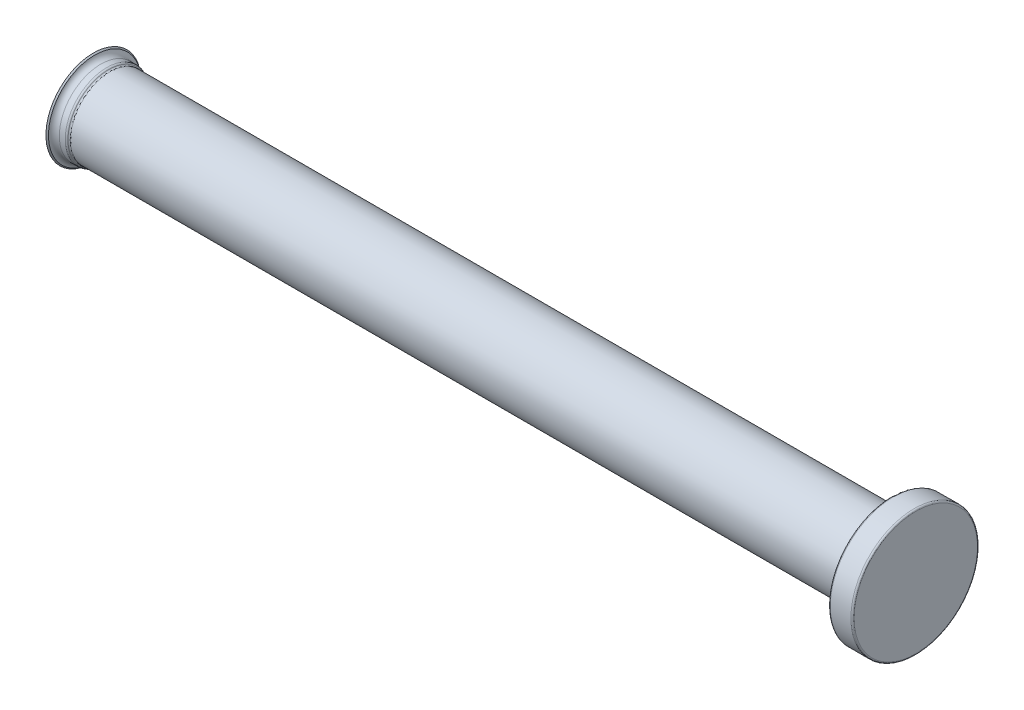
ISO-10303-21;
HEADER;
FILE_DESCRIPTION(('STEP AP214'),'2;1');
FILE_NAME('part.step','',(''),(''),'','','');
FILE_SCHEMA(('AUTOMOTIVE_DESIGN { 1 0 10303 214 1 1 1 1 }'));
ENDSEC;
DATA;
#1=APPLICATION_CONTEXT('core data for automotive mechanical design processes');
#2=APPLICATION_PROTOCOL_DEFINITION('international standard','automotive_design',2000,#1);
#3=PRODUCT_CONTEXT('',#1,'mechanical');
#4=PRODUCT('Part','Part','',(#3));
#5=PRODUCT_RELATED_PRODUCT_CATEGORY('part','',(#4));
#6=PRODUCT_DEFINITION_FORMATION('','',#4);
#7=PRODUCT_DEFINITION_CONTEXT('part definition',#1,'design');
#8=PRODUCT_DEFINITION('design','',#6,#7);
#9=PRODUCT_DEFINITION_SHAPE('','',#8);
#10=(LENGTH_UNIT() NAMED_UNIT(*) SI_UNIT(.MILLI.,.METRE.));
#11=(NAMED_UNIT(*) PLANE_ANGLE_UNIT() SI_UNIT($,.RADIAN.));
#12=(NAMED_UNIT(*) SI_UNIT($,.STERADIAN.) SOLID_ANGLE_UNIT());
#13=UNCERTAINTY_MEASURE_WITH_UNIT(LENGTH_MEASURE(1.E-05),#10,'distance_accuracy_value','');
#14=(GEOMETRIC_REPRESENTATION_CONTEXT(3) GLOBAL_UNCERTAINTY_ASSIGNED_CONTEXT((#13)) GLOBAL_UNIT_ASSIGNED_CONTEXT((#10,
#11,#12)) REPRESENTATION_CONTEXT('',''));
#15=CARTESIAN_POINT('',(0.,0.,0.));
#16=DIRECTION('',(0.,0.,1.));
#17=DIRECTION('',(1.,0.,0.));
#18=AXIS2_PLACEMENT_3D('',#15,#16,#17);
#19=CARTESIAN_POINT('',(-51.5,0.,0.));
#20=DIRECTION('',(1.,0.,0.));
#21=DIRECTION('',(0.,0.,-1.));
#22=AXIS2_PLACEMENT_3D('',#19,#20,#21);
#23=TOROIDAL_SURFACE('',#22,3.02521946668532,0.525219466685324);
#24=CARTESIAN_POINT('',(-51.5,0.,0.));
#25=DIRECTION('',(1.,0.,0.));
#26=DIRECTION('',(0.,0.,-1.));
#27=AXIS2_PLACEMENT_3D('',#24,#25,#26);
#28=CIRCLE('',#27,2.49999999999999);
#29=CARTESIAN_POINT('',(-51.5,0.,-2.49999999999999));
#30=VERTEX_POINT('',#29);
#31=EDGE_CURVE('E77',#30,#30,#28,.T.);
#32=ORIENTED_EDGE('',*,*,#31,.T.);
#33=EDGE_LOOP('',(#32));
#34=FACE_BOUND('',#33,.T.);
#35=CARTESIAN_POINT('',(-52.0081443403791,0.,0.));
#36=DIRECTION('',(1.,0.,0.));
#37=DIRECTION('',(0.,0.,-1.));
#38=AXIS2_PLACEMENT_3D('',#35,#36,#37);
#39=CIRCLE('',#38,2.8923856700598);
#40=CARTESIAN_POINT('',(-52.0081443403791,0.,-2.8923856700598));
#41=VERTEX_POINT('',#40);
#42=EDGE_CURVE('E11',#41,#41,#39,.T.);
#43=ORIENTED_EDGE('',*,*,#42,.F.);
#44=EDGE_LOOP('',(#43));
#45=FACE_BOUND('',#44,.T.);
#46=ADVANCED_FACE('F40',(#34,#45),#23,.T.);
#47=CARTESIAN_POINT('',(-51.9715621544505,0.,0.));
#48=DIRECTION('',(1.,0.,0.));
#49=DIRECTION('',(0.,0.,-1.));
#50=AXIS2_PLACEMENT_3D('',#47,#48,#49);
#51=CONICAL_SURFACE('',#50,3.,1.24311351451278);
#52=ORIENTED_EDGE('',*,*,#42,.T.);
#53=EDGE_LOOP('',(#52));
#54=FACE_BOUND('',#53,.T.);
#55=CARTESIAN_POINT('',(-51.9715621544505,0.,0.));
#56=DIRECTION('',(1.,0.,0.));
#57=DIRECTION('',(0.,0.,-1.));
#58=AXIS2_PLACEMENT_3D('',#55,#56,#57);
#59=CIRCLE('',#58,3.);
#60=CARTESIAN_POINT('',(-51.9715621544505,0.,-3.));
#61=VERTEX_POINT('',#60);
#62=EDGE_CURVE('E46',#61,#61,#59,.T.);
#63=ORIENTED_EDGE('',*,*,#62,.F.);
#64=EDGE_LOOP('',(#63));
#65=FACE_BOUND('',#64,.T.);
#66=ADVANCED_FACE('F95',(#54,#65),#51,.T.);
#67=CARTESIAN_POINT('',(-51.8869958161193,0.,0.));
#68=DIRECTION('',(-1.,0.,0.));
#69=DIRECTION('',(0.,0.,1.));
#70=AXIS2_PLACEMENT_3D('',#67,#68,#69);
#71=CONICAL_SURFACE('',#70,2.92405505443393,0.731737660460374);
#72=ORIENTED_EDGE('',*,*,#62,.T.);
#73=EDGE_LOOP('',(#72));
#74=FACE_BOUND('',#73,.T.);
#75=CARTESIAN_POINT('',(-51.8869958161193,0.,0.));
#76=DIRECTION('',(1.,0.,0.));
#77=DIRECTION('',(0.,0.,-1.));
#78=AXIS2_PLACEMENT_3D('',#75,#76,#77);
#79=CIRCLE('',#78,2.92405505443393);
#80=CARTESIAN_POINT('',(-51.8869958161193,0.,-2.92405505443393));
#81=VERTEX_POINT('',#80);
#82=EDGE_CURVE('E50',#81,#81,#79,.T.);
#83=ORIENTED_EDGE('',*,*,#82,.F.);
#84=EDGE_LOOP('',(#83));
#85=FACE_BOUND('',#84,.T.);
#86=ADVANCED_FACE('F99',(#74,#85),#71,.T.);
#87=CARTESIAN_POINT('',(-51.5,0.,0.));
#88=DIRECTION('',(1.,0.,0.));
#89=DIRECTION('',(0.,0.,-1.));
#90=AXIS2_PLACEMENT_3D('',#87,#88,#89);
#91=TOROIDAL_SURFACE('',#90,3.02521946668532,0.4);
#92=ORIENTED_EDGE('',*,*,#82,.T.);
#93=EDGE_LOOP('',(#92));
#94=FACE_BOUND('',#93,.T.);
#95=CARTESIAN_POINT('',(-51.5,0.,0.));
#96=DIRECTION('',(1.,0.,0.));
#97=DIRECTION('',(0.,0.,-1.));
#98=AXIS2_PLACEMENT_3D('',#95,#96,#97);
#99=CIRCLE('',#98,2.62521946668532);
#100=CARTESIAN_POINT('',(-51.5,0.,-2.62521946668532));
#101=VERTEX_POINT('',#100);
#102=EDGE_CURVE('E54',#101,#101,#99,.T.);
#103=ORIENTED_EDGE('',*,*,#102,.F.);
#104=EDGE_LOOP('',(#103));
#105=FACE_BOUND('',#104,.T.);
#106=ADVANCED_FACE('F103',(#94,#105),#91,.F.);
#107=CARTESIAN_POINT('',(-51.,0.,0.));
#108=DIRECTION('',(1.,0.,0.));
#109=DIRECTION('',(0.,0.,-1.));
#110=AXIS2_PLACEMENT_3D('',#107,#108,#109);
#111=CYLINDRICAL_SURFACE('',#110,2.62521946668532);
#112=ORIENTED_EDGE('',*,*,#102,.T.);
#113=EDGE_LOOP('',(#112));
#114=FACE_BOUND('',#113,.T.);
#115=CARTESIAN_POINT('',(-51.1252194666853,0.,0.));
#116=DIRECTION('',(1.,0.,0.));
#117=DIRECTION('',(0.,0.,-1.));
#118=AXIS2_PLACEMENT_3D('',#115,#116,#117);
#119=CIRCLE('',#118,2.62521946668532);
#120=CARTESIAN_POINT('',(-51.1252194666853,0.,-2.62521946668532));
#121=VERTEX_POINT('',#120);
#122=EDGE_CURVE('E59',#121,#121,#119,.T.);
#123=ORIENTED_EDGE('',*,*,#122,.F.);
#124=EDGE_LOOP('',(#123));
#125=FACE_BOUND('',#124,.T.);
#126=ADVANCED_FACE('F109',(#114,#125),#111,.T.);
#127=CARTESIAN_POINT('',(-51.1252194666853,0.,0.));
#128=DIRECTION('',(1.,0.,0.));
#129=DIRECTION('',(0.,0.,-1.));
#130=AXIS2_PLACEMENT_3D('',#127,#128,#129);
#131=TOROIDAL_SURFACE('',#130,2.5,0.125219466685319);
#132=ORIENTED_EDGE('',*,*,#122,.T.);
#133=EDGE_LOOP('',(#132));
#134=FACE_BOUND('',#133,.T.);
#135=CARTESIAN_POINT('',(-51.0167762274875,0.,0.));
#136=DIRECTION('',(1.,0.,0.));
#137=DIRECTION('',(0.,0.,-1.));
#138=AXIS2_PLACEMENT_3D('',#135,#136,#137);
#139=CIRCLE('',#138,2.56260973334266);
#140=CARTESIAN_POINT('',(-51.0167762274875,0.,-2.56260973334266));
#141=VERTEX_POINT('',#140);
#142=EDGE_CURVE('E62',#141,#141,#139,.T.);
#143=ORIENTED_EDGE('',*,*,#142,.F.);
#144=EDGE_LOOP('',(#143));
#145=FACE_BOUND('',#144,.T.);
#146=ADVANCED_FACE('F113',(#134,#145),#131,.T.);
#147=CARTESIAN_POINT('',(-50.9083329882897,0.,0.));
#148=DIRECTION('',(1.,0.,0.));
#149=DIRECTION('',(0.,0.,-1.));
#150=AXIS2_PLACEMENT_3D('',#147,#148,#149);
#151=TOROIDAL_SURFACE('',#150,2.62521946668532,0.125219466685323);
#152=ORIENTED_EDGE('',*,*,#142,.T.);
#153=EDGE_LOOP('',(#152));
#154=FACE_BOUND('',#153,.T.);
#155=CARTESIAN_POINT('',(-50.9083329882897,0.,0.));
#156=DIRECTION('',(1.,0.,0.));
#157=DIRECTION('',(0.,0.,-1.));
#158=AXIS2_PLACEMENT_3D('',#155,#156,#157);
#159=CIRCLE('',#158,2.5);
#160=CARTESIAN_POINT('',(-50.9083329882897,0.,-2.5));
#161=VERTEX_POINT('',#160);
#162=EDGE_CURVE('E65',#161,#161,#159,.T.);
#163=ORIENTED_EDGE('',*,*,#162,.F.);
#164=EDGE_LOOP('',(#163));
#165=FACE_BOUND('',#164,.T.);
#166=ADVANCED_FACE('F117',(#154,#165),#151,.F.);
#167=CARTESIAN_POINT('',(-50.9083329882897,2.5,0.));
#168=DIRECTION('',(1.,0.,0.));
#169=DIRECTION('',(0.,0.,-1.));
#170=AXIS2_PLACEMENT_3D('',#167,#168,#169);
#171=PLANE('',#170);
#172=ORIENTED_EDGE('',*,*,#162,.T.);
#173=EDGE_LOOP('',(#172));
#174=FACE_BOUND('',#173,.T.);
#175=CARTESIAN_POINT('',(-50.9083329882897,0.,0.));
#176=DIRECTION('',(1.,0.,0.));
#177=DIRECTION('',(0.,0.,-1.));
#178=AXIS2_PLACEMENT_3D('',#175,#176,#177);
#179=CIRCLE('',#178,2.00059573308664);
#180=CARTESIAN_POINT('',(-50.9083329882897,0.,-2.00059573308664));
#181=VERTEX_POINT('',#180);
#182=EDGE_CURVE('E68',#181,#181,#179,.T.);
#183=ORIENTED_EDGE('',*,*,#182,.F.);
#184=EDGE_LOOP('',(#183));
#185=FACE_BOUND('',#184,.T.);
#186=ADVANCED_FACE('F121',(#174,#185),#171,.T.);
#187=CARTESIAN_POINT('',(-51.,0.,0.));
#188=DIRECTION('',(-1.,0.,0.));
#189=DIRECTION('',(0.,0.,1.));
#190=AXIS2_PLACEMENT_3D('',#187,#188,#189);
#191=CONICAL_SURFACE('',#190,2.40261794878175,1.34661422179852);
#192=ORIENTED_EDGE('',*,*,#182,.T.);
#193=EDGE_LOOP('',(#192));
#194=FACE_BOUND('',#193,.T.);
#195=CARTESIAN_POINT('',(-51.,0.,0.));
#196=DIRECTION('',(1.,0.,0.));
#197=DIRECTION('',(0.,0.,-1.));
#198=AXIS2_PLACEMENT_3D('',#195,#196,#197);
#199=CIRCLE('',#198,2.40261794878175);
#200=CARTESIAN_POINT('',(-51.,0.,-2.40261794878175));
#201=VERTEX_POINT('',#200);
#202=EDGE_CURVE('E71',#201,#201,#199,.T.);
#203=ORIENTED_EDGE('',*,*,#202,.F.);
#204=EDGE_LOOP('',(#203));
#205=FACE_BOUND('',#204,.T.);
#206=ADVANCED_FACE('F91',(#194,#205),#191,.F.);
#207=CARTESIAN_POINT('',(-51.1220860071305,0.,0.));
#208=DIRECTION('',(1.,0.,0.));
#209=DIRECTION('',(0.,0.,-1.));
#210=AXIS2_PLACEMENT_3D('',#207,#208,#209);
#211=TOROIDAL_SURFACE('',#210,2.37478053331467,0.125219466685323);
#212=ORIENTED_EDGE('',*,*,#202,.T.);
#213=EDGE_LOOP('',(#212));
#214=FACE_BOUND('',#213,.T.);
#215=CARTESIAN_POINT('',(-51.1220860071305,0.,0.));
#216=DIRECTION('',(1.,0.,0.));
#217=DIRECTION('',(0.,0.,-1.));
#218=AXIS2_PLACEMENT_3D('',#215,#216,#217);
#219=CIRCLE('',#218,2.5);
#220=CARTESIAN_POINT('',(-51.1220860071305,0.,-2.5));
#221=VERTEX_POINT('',#220);
#222=EDGE_CURVE('E74',#221,#221,#219,.T.);
#223=ORIENTED_EDGE('',*,*,#222,.F.);
#224=EDGE_LOOP('',(#223));
#225=FACE_BOUND('',#224,.T.);
#226=ADVANCED_FACE('F85',(#214,#225),#211,.F.);
#227=CARTESIAN_POINT('',(-51.,0.,0.));
#228=DIRECTION('',(1.,0.,0.));
#229=DIRECTION('',(0.,0.,-1.));
#230=AXIS2_PLACEMENT_3D('',#227,#228,#229);
#231=CYLINDRICAL_SURFACE('',#230,2.5);
#232=ORIENTED_EDGE('',*,*,#222,.T.);
#233=EDGE_LOOP('',(#232));
#234=FACE_BOUND('',#233,.T.);
#235=ORIENTED_EDGE('',*,*,#31,.F.);
#236=EDGE_LOOP('',(#235));
#237=FACE_BOUND('',#236,.T.);
#238=ADVANCED_FACE('F83',(#234,#237),#231,.F.);
#239=CLOSED_SHELL('',(#46,#66,#86,#106,#126,#146,#166,#186,#206,#226,#238));
#240=MANIFOLD_SOLID_BREP('B2',#239);
#241=CARTESIAN_POINT('',(0.,0.,0.));
#242=DIRECTION('',(-1.,0.,0.));
#243=DIRECTION('',(0.,0.,1.));
#244=AXIS2_PLACEMENT_3D('',#241,#242,#243);
#245=PLANE('',#244);
#246=CARTESIAN_POINT('',(0.,0.,0.));
#247=DIRECTION('',(-1.,0.,0.));
#248=DIRECTION('',(0.,0.,1.));
#249=AXIS2_PLACEMENT_3D('',#246,#247,#248);
#250=CIRCLE('',#249,3.9);
#251=CARTESIAN_POINT('',(0.,0.,3.9));
#252=VERTEX_POINT('',#251);
#253=EDGE_CURVE('E213',#252,#252,#250,.F.);
#254=ORIENTED_EDGE('',*,*,#253,.T.);
#255=EDGE_LOOP('',(#254));
#256=FACE_BOUND('',#255,.T.);
#257=ADVANCED_FACE('F206',(#256),#245,.F.);
#258=CARTESIAN_POINT('',(0.,0.,0.));
#259=DIRECTION('',(-1.,0.,0.));
#260=DIRECTION('',(0.,0.,1.));
#261=AXIS2_PLACEMENT_3D('',#258,#259,#260);
#262=CYLINDRICAL_SURFACE('',#261,4.);
#263=CARTESIAN_POINT('',(-0.1,0.,0.));
#264=DIRECTION('',(-1.,0.,0.));
#265=DIRECTION('',(0.,0.,1.));
#266=AXIS2_PLACEMENT_3D('',#263,#264,#265);
#267=CIRCLE('',#266,4.);
#268=CARTESIAN_POINT('',(-0.1,0.,4.));
#269=VERTEX_POINT('',#268);
#270=EDGE_CURVE('E232',#269,#269,#267,.T.);
#271=ORIENTED_EDGE('',*,*,#270,.T.);
#272=EDGE_LOOP('',(#271));
#273=FACE_BOUND('',#272,.T.);
#274=CARTESIAN_POINT('',(-1.4,0.,0.));
#275=DIRECTION('',(1.,0.,0.));
#276=DIRECTION('',(0.,0.,-1.));
#277=AXIS2_PLACEMENT_3D('',#274,#275,#276);
#278=CIRCLE('',#277,4.);
#279=CARTESIAN_POINT('',(-1.4,0.,-4.));
#280=VERTEX_POINT('',#279);
#281=EDGE_CURVE('E227',#280,#280,#278,.T.);
#282=ORIENTED_EDGE('',*,*,#281,.T.);
#283=EDGE_LOOP('',(#282));
#284=FACE_BOUND('',#283,.T.);
#285=ADVANCED_FACE('F244',(#273,#284),#262,.T.);
#286=CARTESIAN_POINT('',(-1.5,4.,0.));
#287=DIRECTION('',(1.,0.,0.));
#288=DIRECTION('',(0.,0.,-1.));
#289=AXIS2_PLACEMENT_3D('',#286,#287,#288);
#290=PLANE('',#289);
#291=CARTESIAN_POINT('',(-1.5,0.,0.));
#292=DIRECTION('',(1.,0.,0.));
#293=DIRECTION('',(0.,0.,-1.));
#294=AXIS2_PLACEMENT_3D('',#291,#292,#293);
#295=CIRCLE('',#294,3.9);
#296=CARTESIAN_POINT('',(-1.5,0.,-3.9));
#297=VERTEX_POINT('',#296);
#298=EDGE_CURVE('E38',#297,#297,#295,.F.);
#299=ORIENTED_EDGE('',*,*,#298,.T.);
#300=EDGE_LOOP('',(#299));
#301=FACE_BOUND('',#300,.T.);
#302=CARTESIAN_POINT('',(-1.5,0.,0.));
#303=DIRECTION('',(-1.,0.,0.));
#304=DIRECTION('',(0.,0.,1.));
#305=AXIS2_PLACEMENT_3D('',#302,#303,#304);
#306=CIRCLE('',#305,2.5);
#307=CARTESIAN_POINT('',(-1.5,0.,2.5));
#308=VERTEX_POINT('',#307);
#309=EDGE_CURVE('E224',#308,#308,#306,.T.);
#310=ORIENTED_EDGE('',*,*,#309,.F.);
#311=EDGE_LOOP('',(#310));
#312=FACE_BOUND('',#311,.T.);
#313=ADVANCED_FACE('F247',(#301,#312),#290,.F.);
#314=CARTESIAN_POINT('',(0.,0.,0.));
#315=DIRECTION('',(-1.,0.,0.));
#316=DIRECTION('',(0.,0.,1.));
#317=AXIS2_PLACEMENT_3D('',#314,#315,#316);
#318=CYLINDRICAL_SURFACE('',#317,2.5);
#319=CARTESIAN_POINT('',(-51.,0.,0.));
#320=DIRECTION('',(-1.,0.,0.));
#321=DIRECTION('',(0.,0.,1.));
#322=AXIS2_PLACEMENT_3D('',#319,#320,#321);
#323=CIRCLE('',#322,2.49999999999999);
#324=CARTESIAN_POINT('',(-51.,0.,2.49999999999999));
#325=VERTEX_POINT('',#324);
#326=EDGE_CURVE('E222',#325,#325,#323,.T.);
#327=ORIENTED_EDGE('',*,*,#326,.F.);
#328=EDGE_LOOP('',(#327));
#329=FACE_BOUND('',#328,.T.);
#330=ORIENTED_EDGE('',*,*,#309,.T.);
#331=EDGE_LOOP('',(#330));
#332=FACE_BOUND('',#331,.T.);
#333=ADVANCED_FACE('F241',(#329,#332),#318,.T.);
#334=CARTESIAN_POINT('',(-0.1,0.,0.));
#335=DIRECTION('',(-1.,0.,0.));
#336=DIRECTION('',(0.,0.,1.));
#337=AXIS2_PLACEMENT_3D('',#334,#335,#336);
#338=TOROIDAL_SURFACE('',#337,3.9,0.1);
#339=ORIENTED_EDGE('',*,*,#253,.F.);
#340=EDGE_LOOP('',(#339));
#341=FACE_BOUND('',#340,.T.);
#342=ORIENTED_EDGE('',*,*,#270,.F.);
#343=EDGE_LOOP('',(#342));
#344=FACE_BOUND('',#343,.T.);
#345=ADVANCED_FACE('F238',(#341,#344),#338,.T.);
#346=CARTESIAN_POINT('',(-1.4,0.,0.));
#347=DIRECTION('',(1.,0.,0.));
#348=DIRECTION('',(0.,0.,-1.));
#349=AXIS2_PLACEMENT_3D('',#346,#347,#348);
#350=TOROIDAL_SURFACE('',#349,3.9,0.1);
#351=ORIENTED_EDGE('',*,*,#281,.F.);
#352=EDGE_LOOP('',(#351));
#353=FACE_BOUND('',#352,.T.);
#354=ORIENTED_EDGE('',*,*,#298,.F.);
#355=EDGE_LOOP('',(#354));
#356=FACE_BOUND('',#355,.T.);
#357=ADVANCED_FACE('F208',(#353,#356),#350,.T.);
#358=CARTESIAN_POINT('',(-51.,0.,0.));
#359=DIRECTION('',(-1.,0.,0.));
#360=DIRECTION('',(0.,0.,1.));
#361=AXIS2_PLACEMENT_3D('',#358,#359,#360);
#362=CONICAL_SURFACE('',#361,2.49999999999999,1.39626340159547);
#363=CARTESIAN_POINT('',(-50.5591825482289,0.,0.));
#364=VERTEX_POINT('',#363);
#365=VERTEX_LOOP('',#364);
#366=FACE_BOUND('',#365,.T.);
#367=ORIENTED_EDGE('',*,*,#326,.T.);
#368=EDGE_LOOP('',(#367));
#369=FACE_BOUND('',#368,.T.);
#370=ADVANCED_FACE('F216',(#366,#369),#362,.F.);
#371=CLOSED_SHELL('',(#257,#285,#313,#333,#345,#357,#370));
#372=MANIFOLD_SOLID_BREP('B6',#371);
#373=ADVANCED_BREP_SHAPE_REPRESENTATION('',(#18,#240,#372),#14);
#374=SHAPE_DEFINITION_REPRESENTATION(#9,#373);
ENDSEC;
END-ISO-10303-21;
